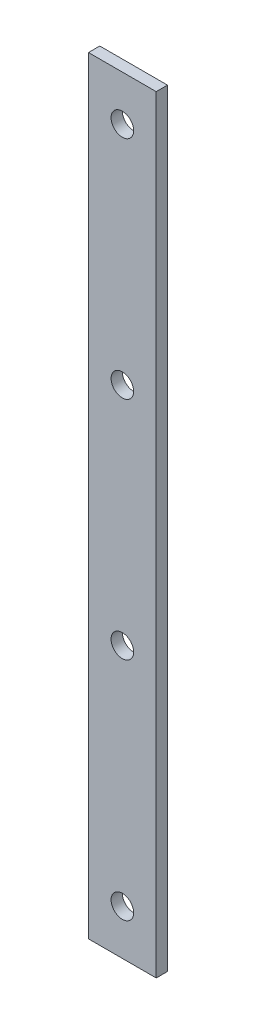
ISO-10303-21;
HEADER;
FILE_DESCRIPTION(('STEP AP214'),'2;1');
FILE_NAME('part.step','',(''),(''),'','','');
FILE_SCHEMA(('AUTOMOTIVE_DESIGN { 1 0 10303 214 1 1 1 1 }'));
ENDSEC;
DATA;
#1=APPLICATION_CONTEXT('core data for automotive mechanical design processes');
#2=APPLICATION_PROTOCOL_DEFINITION('international standard','automotive_design',2000,#1);
#3=PRODUCT_CONTEXT('',#1,'mechanical');
#4=PRODUCT('Part','Part','',(#3));
#5=PRODUCT_RELATED_PRODUCT_CATEGORY('part','',(#4));
#6=PRODUCT_DEFINITION_FORMATION('','',#4);
#7=PRODUCT_DEFINITION_CONTEXT('part definition',#1,'design');
#8=PRODUCT_DEFINITION('design','',#6,#7);
#9=PRODUCT_DEFINITION_SHAPE('','',#8);
#10=(LENGTH_UNIT() NAMED_UNIT(*) SI_UNIT(.MILLI.,.METRE.));
#11=(NAMED_UNIT(*) PLANE_ANGLE_UNIT() SI_UNIT($,.RADIAN.));
#12=(NAMED_UNIT(*) SI_UNIT($,.STERADIAN.) SOLID_ANGLE_UNIT());
#13=UNCERTAINTY_MEASURE_WITH_UNIT(LENGTH_MEASURE(1.E-05),#10,'distance_accuracy_value','');
#14=(GEOMETRIC_REPRESENTATION_CONTEXT(3) GLOBAL_UNCERTAINTY_ASSIGNED_CONTEXT((#13)) GLOBAL_UNIT_ASSIGNED_CONTEXT((#10,
#11,#12)) REPRESENTATION_CONTEXT('',''));
#15=CARTESIAN_POINT('',(0.,0.,0.));
#16=DIRECTION('',(0.,0.,1.));
#17=DIRECTION('',(1.,0.,0.));
#18=AXIS2_PLACEMENT_3D('',#15,#16,#17);
#19=CARTESIAN_POINT('',(0.,0.,5.));
#20=DIRECTION('',(0.,0.,-1.));
#21=DIRECTION('',(-1.,0.,0.));
#22=AXIS2_PLACEMENT_3D('',#19,#20,#21);
#23=PLANE('',#22);
#24=DIRECTION('',(0.,1.,0.));
#25=VECTOR('',#24,1.);
#26=CARTESIAN_POINT('',(15.,-170.,5.));
#27=LINE('',#26,#25);
#28=CARTESIAN_POINT('',(15.,-170.,5.));
#29=VERTEX_POINT('',#28);
#30=CARTESIAN_POINT('',(15.,170.,5.));
#31=VERTEX_POINT('',#30);
#32=EDGE_CURVE('E85',#29,#31,#27,.T.);
#33=ORIENTED_EDGE('',*,*,#32,.T.);
#34=DIRECTION('',(-1.,0.,0.));
#35=VECTOR('',#34,1.);
#36=CARTESIAN_POINT('',(-15.,170.,5.));
#37=LINE('',#36,#35);
#38=CARTESIAN_POINT('',(-15.,170.,5.));
#39=VERTEX_POINT('',#38);
#40=EDGE_CURVE('E80',#31,#39,#37,.T.);
#41=ORIENTED_EDGE('',*,*,#40,.T.);
#42=DIRECTION('',(0.,-1.,0.));
#43=VECTOR('',#42,1.);
#44=CARTESIAN_POINT('',(-15.,-170.,5.));
#45=LINE('',#44,#43);
#46=CARTESIAN_POINT('',(-15.,-170.,5.));
#47=VERTEX_POINT('',#46);
#48=EDGE_CURVE('E83',#39,#47,#45,.T.);
#49=ORIENTED_EDGE('',*,*,#48,.T.);
#50=DIRECTION('',(1.,0.,0.));
#51=VECTOR('',#50,1.);
#52=CARTESIAN_POINT('',(-15.,-170.,5.));
#53=LINE('',#52,#51);
#54=EDGE_CURVE('E50',#47,#29,#53,.T.);
#55=ORIENTED_EDGE('',*,*,#54,.T.);
#56=EDGE_LOOP('',(#33,#41,#49,#55));
#57=FACE_BOUND('',#56,.T.);
#58=CARTESIAN_POINT('',(0.,-50.,5.));
#59=DIRECTION('',(0.,0.,1.));
#60=DIRECTION('',(1.,0.,0.));
#61=AXIS2_PLACEMENT_3D('',#58,#59,#60);
#62=CIRCLE('',#61,5.);
#63=CARTESIAN_POINT('',(5.,-50.,5.));
#64=VERTEX_POINT('',#63);
#65=EDGE_CURVE('E100',#64,#64,#62,.T.);
#66=ORIENTED_EDGE('',*,*,#65,.F.);
#67=EDGE_LOOP('',(#66));
#68=FACE_BOUND('',#67,.T.);
#69=CARTESIAN_POINT('',(0.,-150.,5.));
#70=DIRECTION('',(0.,0.,1.));
#71=DIRECTION('',(1.,0.,0.));
#72=AXIS2_PLACEMENT_3D('',#69,#70,#71);
#73=CIRCLE('',#72,5.);
#74=CARTESIAN_POINT('',(5.,-150.,5.));
#75=VERTEX_POINT('',#74);
#76=EDGE_CURVE('E115',#75,#75,#73,.T.);
#77=ORIENTED_EDGE('',*,*,#76,.F.);
#78=EDGE_LOOP('',(#77));
#79=FACE_BOUND('',#78,.T.);
#80=CARTESIAN_POINT('',(0.,50.,5.));
#81=DIRECTION('',(0.,0.,1.));
#82=DIRECTION('',(-1.,0.,0.));
#83=AXIS2_PLACEMENT_3D('',#80,#81,#82);
#84=CIRCLE('',#83,5.);
#85=CARTESIAN_POINT('',(-5.,50.,5.));
#86=VERTEX_POINT('',#85);
#87=EDGE_CURVE('E121',#86,#86,#84,.T.);
#88=ORIENTED_EDGE('',*,*,#87,.F.);
#89=EDGE_LOOP('',(#88));
#90=FACE_BOUND('',#89,.T.);
#91=CARTESIAN_POINT('',(0.,150.,5.));
#92=DIRECTION('',(0.,0.,1.));
#93=DIRECTION('',(-1.,0.,0.));
#94=AXIS2_PLACEMENT_3D('',#91,#92,#93);
#95=CIRCLE('',#94,5.);
#96=CARTESIAN_POINT('',(-5.,150.,5.));
#97=VERTEX_POINT('',#96);
#98=EDGE_CURVE('E127',#97,#97,#95,.T.);
#99=ORIENTED_EDGE('',*,*,#98,.F.);
#100=EDGE_LOOP('',(#99));
#101=FACE_BOUND('',#100,.T.);
#102=ADVANCED_FACE('F33',(#57,#68,#79,#90,#101),#23,.F.);
#103=CARTESIAN_POINT('',(0.,0.,0.));
#104=DIRECTION('',(0.,0.,-1.));
#105=DIRECTION('',(-1.,0.,0.));
#106=AXIS2_PLACEMENT_3D('',#103,#104,#105);
#107=PLANE('',#106);
#108=CARTESIAN_POINT('',(0.,50.,0.));
#109=DIRECTION('',(0.,0.,1.));
#110=DIRECTION('',(-1.,0.,0.));
#111=AXIS2_PLACEMENT_3D('',#108,#109,#110);
#112=CIRCLE('',#111,5.);
#113=CARTESIAN_POINT('',(-5.,50.,0.));
#114=VERTEX_POINT('',#113);
#115=EDGE_CURVE('E124',#114,#114,#112,.T.);
#116=ORIENTED_EDGE('',*,*,#115,.T.);
#117=EDGE_LOOP('',(#116));
#118=FACE_BOUND('',#117,.T.);
#119=CARTESIAN_POINT('',(0.,-50.,0.));
#120=DIRECTION('',(0.,0.,1.));
#121=DIRECTION('',(1.,0.,0.));
#122=AXIS2_PLACEMENT_3D('',#119,#120,#121);
#123=CIRCLE('',#122,5.);
#124=CARTESIAN_POINT('',(5.,-50.,0.));
#125=VERTEX_POINT('',#124);
#126=EDGE_CURVE('E112',#125,#125,#123,.T.);
#127=ORIENTED_EDGE('',*,*,#126,.T.);
#128=EDGE_LOOP('',(#127));
#129=FACE_BOUND('',#128,.T.);
#130=DIRECTION('',(0.,1.,0.));
#131=VECTOR('',#130,1.);
#132=CARTESIAN_POINT('',(15.,-170.,0.));
#133=LINE('',#132,#131);
#134=CARTESIAN_POINT('',(15.,-170.,0.));
#135=VERTEX_POINT('',#134);
#136=CARTESIAN_POINT('',(15.,170.,0.));
#137=VERTEX_POINT('',#136);
#138=EDGE_CURVE('E97',#135,#137,#133,.T.);
#139=ORIENTED_EDGE('',*,*,#138,.F.);
#140=DIRECTION('',(1.,0.,0.));
#141=VECTOR('',#140,1.);
#142=CARTESIAN_POINT('',(-15.,-170.,0.));
#143=LINE('',#142,#141);
#144=CARTESIAN_POINT('',(-15.,-170.,0.));
#145=VERTEX_POINT('',#144);
#146=EDGE_CURVE('E73',#145,#135,#143,.T.);
#147=ORIENTED_EDGE('',*,*,#146,.F.);
#148=DIRECTION('',(0.,-1.,0.));
#149=VECTOR('',#148,1.);
#150=CARTESIAN_POINT('',(-15.,-170.,0.));
#151=LINE('',#150,#149);
#152=CARTESIAN_POINT('',(-15.,170.,0.));
#153=VERTEX_POINT('',#152);
#154=EDGE_CURVE('E67',#153,#145,#151,.T.);
#155=ORIENTED_EDGE('',*,*,#154,.F.);
#156=DIRECTION('',(-1.,0.,0.));
#157=VECTOR('',#156,1.);
#158=CARTESIAN_POINT('',(-15.,170.,0.));
#159=LINE('',#158,#157);
#160=EDGE_CURVE('E89',#137,#153,#159,.T.);
#161=ORIENTED_EDGE('',*,*,#160,.F.);
#162=EDGE_LOOP('',(#139,#147,#155,#161));
#163=FACE_BOUND('',#162,.T.);
#164=CARTESIAN_POINT('',(0.,-150.,0.));
#165=DIRECTION('',(0.,0.,1.));
#166=DIRECTION('',(1.,0.,0.));
#167=AXIS2_PLACEMENT_3D('',#164,#165,#166);
#168=CIRCLE('',#167,5.);
#169=CARTESIAN_POINT('',(5.,-150.,0.));
#170=VERTEX_POINT('',#169);
#171=EDGE_CURVE('E118',#170,#170,#168,.T.);
#172=ORIENTED_EDGE('',*,*,#171,.T.);
#173=EDGE_LOOP('',(#172));
#174=FACE_BOUND('',#173,.T.);
#175=CARTESIAN_POINT('',(0.,150.,0.));
#176=DIRECTION('',(0.,0.,1.));
#177=DIRECTION('',(-1.,0.,0.));
#178=AXIS2_PLACEMENT_3D('',#175,#176,#177);
#179=CIRCLE('',#178,5.);
#180=CARTESIAN_POINT('',(-5.,150.,0.));
#181=VERTEX_POINT('',#180);
#182=EDGE_CURVE('E130',#181,#181,#179,.T.);
#183=ORIENTED_EDGE('',*,*,#182,.T.);
#184=EDGE_LOOP('',(#183));
#185=FACE_BOUND('',#184,.T.);
#186=ADVANCED_FACE('F108',(#118,#129,#163,#174,#185),#107,.T.);
#187=CARTESIAN_POINT('',(15.,-170.,5.));
#188=DIRECTION('',(-1.,0.,0.));
#189=DIRECTION('',(0.,0.,1.));
#190=AXIS2_PLACEMENT_3D('',#187,#188,#189);
#191=PLANE('',#190);
#192=ORIENTED_EDGE('',*,*,#138,.T.);
#193=DIRECTION('',(0.,0.,-1.));
#194=VECTOR('',#193,1.);
#195=CARTESIAN_POINT('',(15.,170.,5.));
#196=LINE('',#195,#194);
#197=EDGE_CURVE('E11',#31,#137,#196,.T.);
#198=ORIENTED_EDGE('',*,*,#197,.F.);
#199=ORIENTED_EDGE('',*,*,#32,.F.);
#200=DIRECTION('',(0.,0.,-1.));
#201=VECTOR('',#200,1.);
#202=CARTESIAN_POINT('',(15.,-170.,5.));
#203=LINE('',#202,#201);
#204=EDGE_CURVE('E93',#29,#135,#203,.T.);
#205=ORIENTED_EDGE('',*,*,#204,.T.);
#206=EDGE_LOOP('',(#192,#198,#199,#205));
#207=FACE_BOUND('',#206,.T.);
#208=ADVANCED_FACE('F35',(#207),#191,.F.);
#209=CARTESIAN_POINT('',(-15.,170.,5.));
#210=DIRECTION('',(0.,-1.,0.));
#211=DIRECTION('',(0.,0.,-1.));
#212=AXIS2_PLACEMENT_3D('',#209,#210,#211);
#213=PLANE('',#212);
#214=ORIENTED_EDGE('',*,*,#160,.T.);
#215=DIRECTION('',(0.,0.,-1.));
#216=VECTOR('',#215,1.);
#217=CARTESIAN_POINT('',(-15.,170.,5.));
#218=LINE('',#217,#216);
#219=EDGE_CURVE('E42',#39,#153,#218,.T.);
#220=ORIENTED_EDGE('',*,*,#219,.F.);
#221=ORIENTED_EDGE('',*,*,#40,.F.);
#222=ORIENTED_EDGE('',*,*,#197,.T.);
#223=EDGE_LOOP('',(#214,#220,#221,#222));
#224=FACE_BOUND('',#223,.T.);
#225=ADVANCED_FACE('F88',(#224),#213,.F.);
#226=CARTESIAN_POINT('',(-15.,-170.,5.));
#227=DIRECTION('',(1.,0.,0.));
#228=DIRECTION('',(0.,0.,-1.));
#229=AXIS2_PLACEMENT_3D('',#226,#227,#228);
#230=PLANE('',#229);
#231=ORIENTED_EDGE('',*,*,#154,.T.);
#232=DIRECTION('',(0.,0.,-1.));
#233=VECTOR('',#232,1.);
#234=CARTESIAN_POINT('',(-15.,-170.,5.));
#235=LINE('',#234,#233);
#236=EDGE_CURVE('E90',#47,#145,#235,.T.);
#237=ORIENTED_EDGE('',*,*,#236,.F.);
#238=ORIENTED_EDGE('',*,*,#48,.F.);
#239=ORIENTED_EDGE('',*,*,#219,.T.);
#240=EDGE_LOOP('',(#231,#237,#238,#239));
#241=FACE_BOUND('',#240,.T.);
#242=ADVANCED_FACE('F91',(#241),#230,.F.);
#243=CARTESIAN_POINT('',(-15.,-170.,5.));
#244=DIRECTION('',(0.,1.,0.));
#245=DIRECTION('',(0.,0.,1.));
#246=AXIS2_PLACEMENT_3D('',#243,#244,#245);
#247=PLANE('',#246);
#248=ORIENTED_EDGE('',*,*,#146,.T.);
#249=ORIENTED_EDGE('',*,*,#204,.F.);
#250=ORIENTED_EDGE('',*,*,#54,.F.);
#251=ORIENTED_EDGE('',*,*,#236,.T.);
#252=EDGE_LOOP('',(#248,#249,#250,#251));
#253=FACE_BOUND('',#252,.T.);
#254=ADVANCED_FACE('F105',(#253),#247,.F.);
#255=CARTESIAN_POINT('',(0.,-50.,5.));
#256=DIRECTION('',(0.,0.,-1.));
#257=DIRECTION('',(-1.,0.,0.));
#258=AXIS2_PLACEMENT_3D('',#255,#256,#257);
#259=CYLINDRICAL_SURFACE('',#258,5.);
#260=ORIENTED_EDGE('',*,*,#65,.T.);
#261=EDGE_LOOP('',(#260));
#262=FACE_BOUND('',#261,.T.);
#263=ORIENTED_EDGE('',*,*,#126,.F.);
#264=EDGE_LOOP('',(#263));
#265=FACE_BOUND('',#264,.T.);
#266=ADVANCED_FACE('F147',(#262,#265),#259,.F.);
#267=CARTESIAN_POINT('',(0.,-150.,5.));
#268=DIRECTION('',(0.,0.,-1.));
#269=DIRECTION('',(-1.,0.,0.));
#270=AXIS2_PLACEMENT_3D('',#267,#268,#269);
#271=CYLINDRICAL_SURFACE('',#270,5.);
#272=ORIENTED_EDGE('',*,*,#76,.T.);
#273=EDGE_LOOP('',(#272));
#274=FACE_BOUND('',#273,.T.);
#275=ORIENTED_EDGE('',*,*,#171,.F.);
#276=EDGE_LOOP('',(#275));
#277=FACE_BOUND('',#276,.T.);
#278=ADVANCED_FACE('F193',(#274,#277),#271,.F.);
#279=CARTESIAN_POINT('',(0.,50.,5.));
#280=DIRECTION('',(0.,0.,-1.));
#281=DIRECTION('',(-1.,0.,0.));
#282=AXIS2_PLACEMENT_3D('',#279,#280,#281);
#283=CYLINDRICAL_SURFACE('',#282,5.);
#284=ORIENTED_EDGE('',*,*,#87,.T.);
#285=EDGE_LOOP('',(#284));
#286=FACE_BOUND('',#285,.T.);
#287=ORIENTED_EDGE('',*,*,#115,.F.);
#288=EDGE_LOOP('',(#287));
#289=FACE_BOUND('',#288,.T.);
#290=ADVANCED_FACE('F201',(#286,#289),#283,.F.);
#291=CARTESIAN_POINT('',(0.,150.,5.));
#292=DIRECTION('',(0.,0.,-1.));
#293=DIRECTION('',(-1.,0.,0.));
#294=AXIS2_PLACEMENT_3D('',#291,#292,#293);
#295=CYLINDRICAL_SURFACE('',#294,5.);
#296=ORIENTED_EDGE('',*,*,#98,.T.);
#297=EDGE_LOOP('',(#296));
#298=FACE_BOUND('',#297,.T.);
#299=ORIENTED_EDGE('',*,*,#182,.F.);
#300=EDGE_LOOP('',(#299));
#301=FACE_BOUND('',#300,.T.);
#302=ADVANCED_FACE('F136',(#298,#301),#295,.F.);
#303=CLOSED_SHELL('',(#102,#186,#208,#225,#242,#254,#266,#278,#290,#302));
#304=MANIFOLD_SOLID_BREP('B2',#303);
#305=ADVANCED_BREP_SHAPE_REPRESENTATION('',(#18,#304),#14);
#306=SHAPE_DEFINITION_REPRESENTATION(#9,#305);
ENDSEC;
END-ISO-10303-21;
